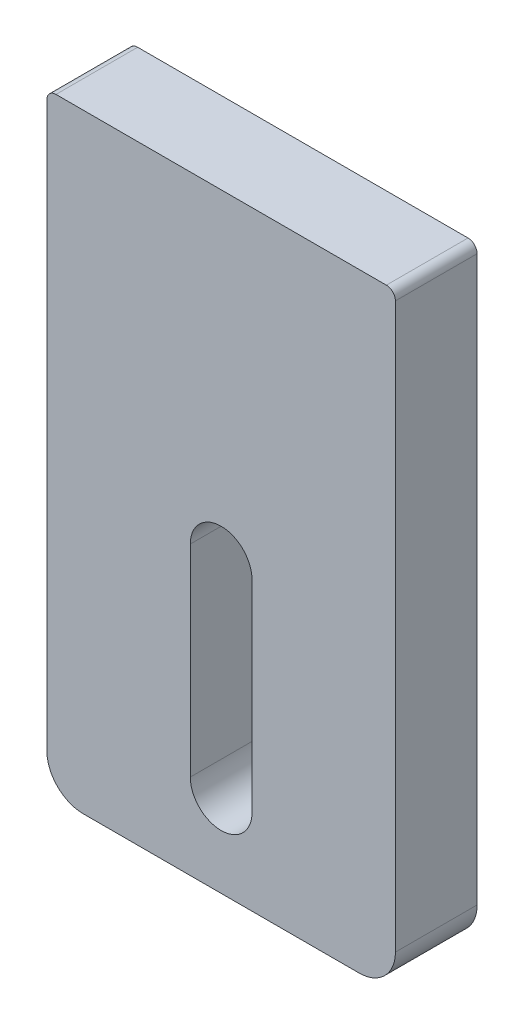
ISO-10303-21;
HEADER;
FILE_DESCRIPTION(('STEP AP214'),'2;1');
FILE_NAME('part.step','',(''),(''),'','','');
FILE_SCHEMA(('AUTOMOTIVE_DESIGN { 1 0 10303 214 1 1 1 1 }'));
ENDSEC;
DATA;
#1=APPLICATION_CONTEXT('core data for automotive mechanical design processes');
#2=APPLICATION_PROTOCOL_DEFINITION('international standard','automotive_design',2000,#1);
#3=PRODUCT_CONTEXT('',#1,'mechanical');
#4=PRODUCT('Part','Part','',(#3));
#5=PRODUCT_RELATED_PRODUCT_CATEGORY('part','',(#4));
#6=PRODUCT_DEFINITION_FORMATION('','',#4);
#7=PRODUCT_DEFINITION_CONTEXT('part definition',#1,'design');
#8=PRODUCT_DEFINITION('design','',#6,#7);
#9=PRODUCT_DEFINITION_SHAPE('','',#8);
#10=(LENGTH_UNIT() NAMED_UNIT(*) SI_UNIT(.MILLI.,.METRE.));
#11=(NAMED_UNIT(*) PLANE_ANGLE_UNIT() SI_UNIT($,.RADIAN.));
#12=(NAMED_UNIT(*) SI_UNIT($,.STERADIAN.) SOLID_ANGLE_UNIT());
#13=UNCERTAINTY_MEASURE_WITH_UNIT(LENGTH_MEASURE(1.E-05),#10,'distance_accuracy_value','');
#14=(GEOMETRIC_REPRESENTATION_CONTEXT(3) GLOBAL_UNCERTAINTY_ASSIGNED_CONTEXT((#13)) GLOBAL_UNIT_ASSIGNED_CONTEXT((#10,
#11,#12)) REPRESENTATION_CONTEXT('',''));
#15=CARTESIAN_POINT('',(0.,0.,0.));
#16=DIRECTION('',(0.,0.,1.));
#17=DIRECTION('',(1.,0.,0.));
#18=AXIS2_PLACEMENT_3D('',#15,#16,#17);
#19=CARTESIAN_POINT('',(0.,0.,0.));
#20=DIRECTION('',(0.,0.,1.));
#21=DIRECTION('',(1.,0.,0.));
#22=AXIS2_PLACEMENT_3D('',#19,#20,#21);
#23=PLANE('',#22);
#24=CARTESIAN_POINT('',(0.,-28.8669759238448,0.));
#25=DIRECTION('',(0.,0.,1.));
#26=DIRECTION('',(1.,0.,0.));
#27=AXIS2_PLACEMENT_3D('',#24,#25,#26);
#28=CIRCLE('',#27,1.69999999999998);
#29=CARTESIAN_POINT('',(-1.69999999999997,-28.8669759238448,0.));
#30=VERTEX_POINT('',#29);
#31=CARTESIAN_POINT('',(1.69999999999999,-28.8669759238448,0.));
#32=VERTEX_POINT('',#31);
#33=EDGE_CURVE('E176',#30,#32,#28,.T.);
#34=ORIENTED_EDGE('',*,*,#33,.T.);
#35=DIRECTION('',(0.,1.,0.));
#36=VECTOR('',#35,1.);
#37=CARTESIAN_POINT('',(1.69999999999999,-17.7508743286044,0.));
#38=LINE('',#37,#36);
#39=CARTESIAN_POINT('',(1.69999999999998,-17.7508743286044,0.));
#40=VERTEX_POINT('',#39);
#41=EDGE_CURVE('E222',#32,#40,#38,.T.);
#42=ORIENTED_EDGE('',*,*,#41,.T.);
#43=CARTESIAN_POINT('',(0.,-17.7508743286044,0.));
#44=DIRECTION('',(0.,0.,1.));
#45=DIRECTION('',(1.,0.,0.));
#46=AXIS2_PLACEMENT_3D('',#43,#44,#45);
#47=CIRCLE('',#46,1.69999999999998);
#48=CARTESIAN_POINT('',(-1.69999999999997,-17.7508743286044,0.));
#49=VERTEX_POINT('',#48);
#50=EDGE_CURVE('E225',#40,#49,#47,.T.);
#51=ORIENTED_EDGE('',*,*,#50,.T.);
#52=DIRECTION('',(0.,-1.,0.));
#53=VECTOR('',#52,1.);
#54=CARTESIAN_POINT('',(-1.69999999999997,-28.8669759238448,0.));
#55=LINE('',#54,#53);
#56=EDGE_CURVE('E212',#49,#30,#55,.T.);
#57=ORIENTED_EDGE('',*,*,#56,.T.);
#58=EDGE_LOOP('',(#34,#42,#51,#57));
#59=FACE_BOUND('',#58,.T.);
#60=CARTESIAN_POINT('',(-7.60000000000002,-31.5669759238448,0.));
#61=DIRECTION('',(0.,0.,1.));
#62=DIRECTION('',(1.,0.,0.));
#63=AXIS2_PLACEMENT_3D('',#60,#61,#62);
#64=CIRCLE('',#63,1.5);
#65=CARTESIAN_POINT('',(-7.60000000000002,-33.0669759238448,0.));
#66=VERTEX_POINT('',#65);
#67=CARTESIAN_POINT('',(-9.10000000000002,-31.5669759238448,0.));
#68=VERTEX_POINT('',#67);
#69=EDGE_CURVE('E184',#66,#68,#64,.F.);
#70=ORIENTED_EDGE('',*,*,#69,.T.);
#71=DIRECTION('',(0.,1.,0.));
#72=VECTOR('',#71,1.);
#73=CARTESIAN_POINT('',(-9.10000000000002,0.,0.));
#74=LINE('',#73,#72);
#75=CARTESIAN_POINT('',(-9.10000000000002,-10.,0.));
#76=VERTEX_POINT('',#75);
#77=EDGE_CURVE('E180',#68,#76,#74,.T.);
#78=ORIENTED_EDGE('',*,*,#77,.T.);
#79=DIRECTION('',(1.,0.,0.));
#80=VECTOR('',#79,1.);
#81=CARTESIAN_POINT('',(-9.60000000000002,-10.,0.));
#82=LINE('',#81,#80);
#83=CARTESIAN_POINT('',(9.10000000000002,-10.,0.));
#84=VERTEX_POINT('',#83);
#85=EDGE_CURVE('E200',#76,#84,#82,.T.);
#86=ORIENTED_EDGE('',*,*,#85,.T.);
#87=DIRECTION('',(0.,-1.,0.));
#88=VECTOR('',#87,1.);
#89=CARTESIAN_POINT('',(9.10000000000002,0.,0.));
#90=LINE('',#89,#88);
#91=CARTESIAN_POINT('',(9.10000000000002,-31.5669759238448,0.));
#92=VERTEX_POINT('',#91);
#93=EDGE_CURVE('E179',#84,#92,#90,.T.);
#94=ORIENTED_EDGE('',*,*,#93,.T.);
#95=CARTESIAN_POINT('',(7.60000000000002,-31.5669759238448,0.));
#96=DIRECTION('',(0.,0.,1.));
#97=DIRECTION('',(1.,0.,0.));
#98=AXIS2_PLACEMENT_3D('',#95,#96,#97);
#99=CIRCLE('',#98,1.49999999999999);
#100=CARTESIAN_POINT('',(7.60000000000002,-33.0669759238448,0.));
#101=VERTEX_POINT('',#100);
#102=EDGE_CURVE('E283',#92,#101,#99,.F.);
#103=ORIENTED_EDGE('',*,*,#102,.T.);
#104=DIRECTION('',(-1.,0.,0.));
#105=VECTOR('',#104,1.);
#106=CARTESIAN_POINT('',(0.,-33.0669759238448,0.));
#107=LINE('',#106,#105);
#108=EDGE_CURVE('E285',#101,#66,#107,.T.);
#109=ORIENTED_EDGE('',*,*,#108,.T.);
#110=EDGE_LOOP('',(#70,#78,#86,#94,#103,#109));
#111=FACE_BOUND('',#110,.T.);
#112=ADVANCED_FACE('F32',(#59,#111),#23,.F.);
#113=CARTESIAN_POINT('',(9.60000000000002,-33.5669759238448,5.));
#114=DIRECTION('',(-1.,0.,0.));
#115=DIRECTION('',(0.,-1.,0.));
#116=AXIS2_PLACEMENT_3D('',#113,#114,#115);
#117=PLANE('',#116);
#118=DIRECTION('',(0.,0.,-1.));
#119=VECTOR('',#118,1.);
#120=CARTESIAN_POINT('',(9.60000000000002,-31.5669759238448,5.));
#121=LINE('',#120,#119);
#122=CARTESIAN_POINT('',(9.60000000000002,-31.5669759238448,5.));
#123=VERTEX_POINT('',#122);
#124=CARTESIAN_POINT('',(9.60000000000002,-31.5669759238448,0.5));
#125=VERTEX_POINT('',#124);
#126=EDGE_CURVE('E153',#123,#125,#121,.T.);
#127=ORIENTED_EDGE('',*,*,#126,.T.);
#128=DIRECTION('',(0.,1.,0.));
#129=VECTOR('',#128,1.);
#130=CARTESIAN_POINT('',(9.60000000000002,-33.5669759238448,0.5));
#131=LINE('',#130,#129);
#132=CARTESIAN_POINT('',(9.60000000000002,-10.,0.5));
#133=VERTEX_POINT('',#132);
#134=EDGE_CURVE('E11',#125,#133,#131,.T.);
#135=ORIENTED_EDGE('',*,*,#134,.T.);
#136=DIRECTION('',(0.,1.,0.));
#137=VECTOR('',#136,1.);
#138=CARTESIAN_POINT('',(9.60000000000002,-10.,0.5));
#139=LINE('',#138,#137);
#140=CARTESIAN_POINT('',(9.60000000000002,-0.500000000000018,0.5));
#141=VERTEX_POINT('',#140);
#142=EDGE_CURVE('E150',#133,#141,#139,.T.);
#143=ORIENTED_EDGE('',*,*,#142,.T.);
#144=DIRECTION('',(0.,0.,-1.));
#145=VECTOR('',#144,1.);
#146=CARTESIAN_POINT('',(9.60000000000002,-0.500000000000014,5.));
#147=LINE('',#146,#145);
#148=CARTESIAN_POINT('',(9.60000000000002,-0.500000000000014,5.));
#149=VERTEX_POINT('',#148);
#150=EDGE_CURVE('E270',#141,#149,#147,.F.);
#151=ORIENTED_EDGE('',*,*,#150,.T.);
#152=DIRECTION('',(0.,1.,0.));
#153=VECTOR('',#152,1.);
#154=CARTESIAN_POINT('',(9.60000000000002,-33.5669759238448,5.));
#155=LINE('',#154,#153);
#156=EDGE_CURVE('E242',#123,#149,#155,.T.);
#157=ORIENTED_EDGE('',*,*,#156,.F.);
#158=EDGE_LOOP('',(#127,#135,#143,#151,#157));
#159=FACE_BOUND('',#158,.T.);
#160=ADVANCED_FACE('F148',(#159),#117,.F.);
#161=CARTESIAN_POINT('',(-9.60000000000002,0.,5.));
#162=DIRECTION('',(1.,0.,0.));
#163=DIRECTION('',(0.,1.,0.));
#164=AXIS2_PLACEMENT_3D('',#161,#162,#163);
#165=PLANE('',#164);
#166=DIRECTION('',(0.,-1.,0.));
#167=VECTOR('',#166,1.);
#168=CARTESIAN_POINT('',(-9.60000000000002,0.,0.5));
#169=LINE('',#168,#167);
#170=CARTESIAN_POINT('',(-9.60000000000002,-0.500000000000014,0.5));
#171=VERTEX_POINT('',#170);
#172=CARTESIAN_POINT('',(-9.60000000000002,-10.,0.5));
#173=VERTEX_POINT('',#172);
#174=EDGE_CURVE('E171',#171,#173,#169,.T.);
#175=ORIENTED_EDGE('',*,*,#174,.T.);
#176=DIRECTION('',(0.,-1.,0.));
#177=VECTOR('',#176,1.);
#178=CARTESIAN_POINT('',(-9.60000000000002,0.,0.5));
#179=LINE('',#178,#177);
#180=CARTESIAN_POINT('',(-9.60000000000002,-31.5669759238448,0.5));
#181=VERTEX_POINT('',#180);
#182=EDGE_CURVE('E279',#173,#181,#179,.T.);
#183=ORIENTED_EDGE('',*,*,#182,.T.);
#184=DIRECTION('',(0.,0.,-1.));
#185=VECTOR('',#184,1.);
#186=CARTESIAN_POINT('',(-9.60000000000002,-31.5669759238448,5.));
#187=LINE('',#186,#185);
#188=CARTESIAN_POINT('',(-9.60000000000002,-31.5669759238448,5.));
#189=VERTEX_POINT('',#188);
#190=EDGE_CURVE('E255',#181,#189,#187,.F.);
#191=ORIENTED_EDGE('',*,*,#190,.T.);
#192=DIRECTION('',(0.,-1.,0.));
#193=VECTOR('',#192,1.);
#194=CARTESIAN_POINT('',(-9.60000000000002,0.,5.));
#195=LINE('',#194,#193);
#196=CARTESIAN_POINT('',(-9.60000000000002,-0.500000000000014,5.));
#197=VERTEX_POINT('',#196);
#198=EDGE_CURVE('E248',#197,#189,#195,.T.);
#199=ORIENTED_EDGE('',*,*,#198,.F.);
#200=DIRECTION('',(0.,0.,-1.));
#201=VECTOR('',#200,1.);
#202=CARTESIAN_POINT('',(-9.60000000000002,-0.500000000000014,5.));
#203=LINE('',#202,#201);
#204=EDGE_CURVE('E276',#197,#171,#203,.T.);
#205=ORIENTED_EDGE('',*,*,#204,.T.);
#206=EDGE_LOOP('',(#175,#183,#191,#199,#205));
#207=FACE_BOUND('',#206,.T.);
#208=ADVANCED_FACE('F299',(#207),#165,.F.);
#209=CARTESIAN_POINT('',(0.,0.,5.));
#210=DIRECTION('',(0.,0.,1.));
#211=DIRECTION('',(1.,0.,0.));
#212=AXIS2_PLACEMENT_3D('',#209,#210,#211);
#213=PLANE('',#212);
#214=ORIENTED_EDGE('',*,*,#156,.T.);
#215=CARTESIAN_POINT('',(9.10000000000002,-0.500000000000014,5.));
#216=DIRECTION('',(0.,0.,1.));
#217=DIRECTION('',(1.,0.,0.));
#218=AXIS2_PLACEMENT_3D('',#215,#216,#217);
#219=CIRCLE('',#218,0.5);
#220=CARTESIAN_POINT('',(9.10000000000002,0.,5.));
#221=VERTEX_POINT('',#220);
#222=EDGE_CURVE('E274',#149,#221,#219,.T.);
#223=ORIENTED_EDGE('',*,*,#222,.T.);
#224=DIRECTION('',(-1.,0.,0.));
#225=VECTOR('',#224,1.);
#226=CARTESIAN_POINT('',(9.60000000000002,0.,5.));
#227=LINE('',#226,#225);
#228=CARTESIAN_POINT('',(-9.10000000000001,0.,5.));
#229=VERTEX_POINT('',#228);
#230=EDGE_CURVE('E245',#221,#229,#227,.T.);
#231=ORIENTED_EDGE('',*,*,#230,.T.);
#232=CARTESIAN_POINT('',(-9.10000000000002,-0.500000000000014,5.));
#233=DIRECTION('',(0.,0.,1.));
#234=DIRECTION('',(1.,0.,0.));
#235=AXIS2_PLACEMENT_3D('',#232,#233,#234);
#236=CIRCLE('',#235,0.5);
#237=EDGE_CURVE('E272',#229,#197,#236,.T.);
#238=ORIENTED_EDGE('',*,*,#237,.T.);
#239=ORIENTED_EDGE('',*,*,#198,.T.);
#240=CARTESIAN_POINT('',(-7.60000000000002,-31.5669759238448,5.));
#241=DIRECTION('',(0.,0.,1.));
#242=DIRECTION('',(1.,0.,0.));
#243=AXIS2_PLACEMENT_3D('',#240,#241,#242);
#244=CIRCLE('',#243,2.);
#245=CARTESIAN_POINT('',(-7.60000000000002,-33.5669759238448,5.));
#246=VERTEX_POINT('',#245);
#247=EDGE_CURVE('E259',#189,#246,#244,.T.);
#248=ORIENTED_EDGE('',*,*,#247,.T.);
#249=DIRECTION('',(1.,0.,0.));
#250=VECTOR('',#249,1.);
#251=CARTESIAN_POINT('',(-9.60000000000002,-33.5669759238448,5.));
#252=LINE('',#251,#250);
#253=CARTESIAN_POINT('',(7.60000000000002,-33.5669759238448,5.));
#254=VERTEX_POINT('',#253);
#255=EDGE_CURVE('E239',#246,#254,#252,.T.);
#256=ORIENTED_EDGE('',*,*,#255,.T.);
#257=CARTESIAN_POINT('',(7.60000000000002,-31.5669759238448,5.));
#258=DIRECTION('',(0.,0.,1.));
#259=DIRECTION('',(1.,0.,0.));
#260=AXIS2_PLACEMENT_3D('',#257,#258,#259);
#261=CIRCLE('',#260,2.);
#262=EDGE_CURVE('E257',#254,#123,#261,.T.);
#263=ORIENTED_EDGE('',*,*,#262,.T.);
#264=EDGE_LOOP('',(#214,#223,#231,#238,#239,#248,#256,#263));
#265=FACE_BOUND('',#264,.T.);
#266=DIRECTION('',(0.,1.,0.));
#267=VECTOR('',#266,1.);
#268=CARTESIAN_POINT('',(1.69999999999999,-17.7508743286044,5.));
#269=LINE('',#268,#267);
#270=CARTESIAN_POINT('',(1.69999999999999,-28.8669759238448,5.));
#271=VERTEX_POINT('',#270);
#272=CARTESIAN_POINT('',(1.69999999999998,-17.7508743286044,5.));
#273=VERTEX_POINT('',#272);
#274=EDGE_CURVE('E211',#271,#273,#269,.T.);
#275=ORIENTED_EDGE('',*,*,#274,.F.);
#276=CARTESIAN_POINT('',(0.,-28.8669759238448,5.));
#277=DIRECTION('',(0.,0.,1.));
#278=DIRECTION('',(1.,0.,0.));
#279=AXIS2_PLACEMENT_3D('',#276,#277,#278);
#280=CIRCLE('',#279,1.69999999999998);
#281=CARTESIAN_POINT('',(-1.69999999999997,-28.8669759238448,5.));
#282=VERTEX_POINT('',#281);
#283=EDGE_CURVE('E209',#282,#271,#280,.T.);
#284=ORIENTED_EDGE('',*,*,#283,.F.);
#285=DIRECTION('',(0.,-1.,0.));
#286=VECTOR('',#285,1.);
#287=CARTESIAN_POINT('',(-1.69999999999997,-28.8669759238448,5.));
#288=LINE('',#287,#286);
#289=CARTESIAN_POINT('',(-1.69999999999997,-17.7508743286044,5.));
#290=VERTEX_POINT('',#289);
#291=EDGE_CURVE('E217',#290,#282,#288,.T.);
#292=ORIENTED_EDGE('',*,*,#291,.F.);
#293=CARTESIAN_POINT('',(0.,-17.7508743286044,5.));
#294=DIRECTION('',(0.,0.,1.));
#295=DIRECTION('',(1.,0.,0.));
#296=AXIS2_PLACEMENT_3D('',#293,#294,#295);
#297=CIRCLE('',#296,1.69999999999998);
#298=EDGE_CURVE('E214',#273,#290,#297,.T.);
#299=ORIENTED_EDGE('',*,*,#298,.F.);
#300=EDGE_LOOP('',(#275,#284,#292,#299));
#301=FACE_BOUND('',#300,.T.);
#302=ADVANCED_FACE('F305',(#265,#301),#213,.T.);
#303=CARTESIAN_POINT('',(-9.60000000000002,-33.5669759238448,5.));
#304=DIRECTION('',(0.,1.,0.));
#305=DIRECTION('',(0.,0.,1.));
#306=AXIS2_PLACEMENT_3D('',#303,#304,#305);
#307=PLANE('',#306);
#308=DIRECTION('',(0.,0.,-1.));
#309=VECTOR('',#308,1.);
#310=CARTESIAN_POINT('',(-7.60000000000002,-33.5669759238448,5.));
#311=LINE('',#310,#309);
#312=CARTESIAN_POINT('',(-7.60000000000002,-33.5669759238448,0.5));
#313=VERTEX_POINT('',#312);
#314=EDGE_CURVE('E253',#246,#313,#311,.T.);
#315=ORIENTED_EDGE('',*,*,#314,.T.);
#316=DIRECTION('',(1.,0.,0.));
#317=VECTOR('',#316,1.);
#318=CARTESIAN_POINT('',(-9.60000000000002,-33.5669759238448,0.5));
#319=LINE('',#318,#317);
#320=CARTESIAN_POINT('',(7.60000000000002,-33.5669759238448,0.5));
#321=VERTEX_POINT('',#320);
#322=EDGE_CURVE('E56',#313,#321,#319,.T.);
#323=ORIENTED_EDGE('',*,*,#322,.T.);
#324=DIRECTION('',(0.,0.,-1.));
#325=VECTOR('',#324,1.);
#326=CARTESIAN_POINT('',(7.60000000000002,-33.5669759238448,5.));
#327=LINE('',#326,#325);
#328=EDGE_CURVE('E251',#321,#254,#327,.F.);
#329=ORIENTED_EDGE('',*,*,#328,.T.);
#330=ORIENTED_EDGE('',*,*,#255,.F.);
#331=EDGE_LOOP('',(#315,#323,#329,#330));
#332=FACE_BOUND('',#331,.T.);
#333=ADVANCED_FACE('F308',(#332),#307,.F.);
#334=CARTESIAN_POINT('',(9.60000000000002,0.,5.));
#335=DIRECTION('',(0.,-1.,0.));
#336=DIRECTION('',(0.,0.,-1.));
#337=AXIS2_PLACEMENT_3D('',#334,#335,#336);
#338=PLANE('',#337);
#339=ORIENTED_EDGE('',*,*,#230,.F.);
#340=DIRECTION('',(0.,0.,-1.));
#341=VECTOR('',#340,1.);
#342=CARTESIAN_POINT('',(9.10000000000002,0.,5.));
#343=LINE('',#342,#341);
#344=CARTESIAN_POINT('',(9.10000000000002,0.,0.5));
#345=VERTEX_POINT('',#344);
#346=EDGE_CURVE('E264',#221,#345,#343,.T.);
#347=ORIENTED_EDGE('',*,*,#346,.T.);
#348=DIRECTION('',(-1.,0.,0.));
#349=VECTOR('',#348,1.);
#350=CARTESIAN_POINT('',(9.60000000000002,0.,0.5));
#351=LINE('',#350,#349);
#352=CARTESIAN_POINT('',(-9.10000000000001,0.,0.5));
#353=VERTEX_POINT('',#352);
#354=EDGE_CURVE('E203',#345,#353,#351,.T.);
#355=ORIENTED_EDGE('',*,*,#354,.T.);
#356=DIRECTION('',(0.,0.,-1.));
#357=VECTOR('',#356,1.);
#358=CARTESIAN_POINT('',(-9.10000000000002,0.,5.));
#359=LINE('',#358,#357);
#360=EDGE_CURVE('E262',#353,#229,#359,.F.);
#361=ORIENTED_EDGE('',*,*,#360,.T.);
#362=EDGE_LOOP('',(#339,#347,#355,#361));
#363=FACE_BOUND('',#362,.T.);
#364=ADVANCED_FACE('F331',(#363),#338,.F.);
#365=CARTESIAN_POINT('',(0.,-28.8669759238448,5.));
#366=DIRECTION('',(0.,0.,-1.));
#367=DIRECTION('',(-1.,0.,0.));
#368=AXIS2_PLACEMENT_3D('',#365,#366,#367);
#369=CYLINDRICAL_SURFACE('',#368,1.69999999999998);
#370=ORIENTED_EDGE('',*,*,#33,.F.);
#371=DIRECTION('',(0.,0.,-1.));
#372=VECTOR('',#371,1.);
#373=CARTESIAN_POINT('',(-1.69999999999997,-28.8669759238448,5.));
#374=LINE('',#373,#372);
#375=EDGE_CURVE('E219',#282,#30,#374,.T.);
#376=ORIENTED_EDGE('',*,*,#375,.F.);
#377=ORIENTED_EDGE('',*,*,#283,.T.);
#378=DIRECTION('',(0.,0.,-1.));
#379=VECTOR('',#378,1.);
#380=CARTESIAN_POINT('',(1.69999999999999,-28.8669759238448,5.));
#381=LINE('',#380,#379);
#382=EDGE_CURVE('E236',#271,#32,#381,.T.);
#383=ORIENTED_EDGE('',*,*,#382,.T.);
#384=EDGE_LOOP('',(#370,#376,#377,#383));
#385=FACE_BOUND('',#384,.T.);
#386=ADVANCED_FACE('F333',(#385),#369,.F.);
#387=CARTESIAN_POINT('',(1.69999999999999,-17.7508743286044,5.));
#388=DIRECTION('',(-1.,0.,0.));
#389=DIRECTION('',(0.,-1.,0.));
#390=AXIS2_PLACEMENT_3D('',#387,#388,#389);
#391=PLANE('',#390);
#392=ORIENTED_EDGE('',*,*,#41,.F.);
#393=ORIENTED_EDGE('',*,*,#382,.F.);
#394=ORIENTED_EDGE('',*,*,#274,.T.);
#395=DIRECTION('',(0.,0.,-1.));
#396=VECTOR('',#395,1.);
#397=CARTESIAN_POINT('',(1.69999999999998,-17.7508743286044,5.));
#398=LINE('',#397,#396);
#399=EDGE_CURVE('E234',#273,#40,#398,.T.);
#400=ORIENTED_EDGE('',*,*,#399,.T.);
#401=EDGE_LOOP('',(#392,#393,#394,#400));
#402=FACE_BOUND('',#401,.T.);
#403=ADVANCED_FACE('F471',(#402),#391,.T.);
#404=CARTESIAN_POINT('',(0.,-17.7508743286044,5.));
#405=DIRECTION('',(0.,0.,-1.));
#406=DIRECTION('',(-1.,0.,0.));
#407=AXIS2_PLACEMENT_3D('',#404,#405,#406);
#408=CYLINDRICAL_SURFACE('',#407,1.69999999999998);
#409=ORIENTED_EDGE('',*,*,#50,.F.);
#410=ORIENTED_EDGE('',*,*,#399,.F.);
#411=ORIENTED_EDGE('',*,*,#298,.T.);
#412=DIRECTION('',(0.,0.,-1.));
#413=VECTOR('',#412,1.);
#414=CARTESIAN_POINT('',(-1.69999999999997,-17.7508743286044,5.));
#415=LINE('',#414,#413);
#416=EDGE_CURVE('E232',#290,#49,#415,.T.);
#417=ORIENTED_EDGE('',*,*,#416,.T.);
#418=EDGE_LOOP('',(#409,#410,#411,#417));
#419=FACE_BOUND('',#418,.T.);
#420=ADVANCED_FACE('F461',(#419),#408,.F.);
#421=CARTESIAN_POINT('',(-1.69999999999997,-28.8669759238448,5.));
#422=DIRECTION('',(1.,0.,0.));
#423=DIRECTION('',(0.,1.,0.));
#424=AXIS2_PLACEMENT_3D('',#421,#422,#423);
#425=PLANE('',#424);
#426=ORIENTED_EDGE('',*,*,#56,.F.);
#427=ORIENTED_EDGE('',*,*,#416,.F.);
#428=ORIENTED_EDGE('',*,*,#291,.T.);
#429=ORIENTED_EDGE('',*,*,#375,.T.);
#430=EDGE_LOOP('',(#426,#427,#428,#429));
#431=FACE_BOUND('',#430,.T.);
#432=ADVANCED_FACE('F340',(#431),#425,.T.);
#433=CARTESIAN_POINT('',(-7.60000000000002,-31.5669759238448,5.));
#434=DIRECTION('',(0.,0.,-1.));
#435=DIRECTION('',(-1.,0.,0.));
#436=AXIS2_PLACEMENT_3D('',#433,#434,#435);
#437=CYLINDRICAL_SURFACE('',#436,2.);
#438=ORIENTED_EDGE('',*,*,#190,.F.);
#439=CARTESIAN_POINT('',(-7.60000000000002,-31.5669759238448,0.5));
#440=DIRECTION('',(0.,0.,1.));
#441=DIRECTION('',(1.,0.,0.));
#442=AXIS2_PLACEMENT_3D('',#439,#440,#441);
#443=CIRCLE('',#442,2.);
#444=EDGE_CURVE('E182',#181,#313,#443,.T.);
#445=ORIENTED_EDGE('',*,*,#444,.T.);
#446=ORIENTED_EDGE('',*,*,#314,.F.);
#447=ORIENTED_EDGE('',*,*,#247,.F.);
#448=EDGE_LOOP('',(#438,#445,#446,#447));
#449=FACE_BOUND('',#448,.T.);
#450=ADVANCED_FACE('F302',(#449),#437,.T.);
#451=CARTESIAN_POINT('',(7.60000000000002,-31.5669759238448,5.));
#452=DIRECTION('',(0.,0.,-1.));
#453=DIRECTION('',(-1.,0.,0.));
#454=AXIS2_PLACEMENT_3D('',#451,#452,#453);
#455=CYLINDRICAL_SURFACE('',#454,2.);
#456=ORIENTED_EDGE('',*,*,#328,.F.);
#457=CARTESIAN_POINT('',(7.60000000000002,-31.5669759238448,0.5));
#458=DIRECTION('',(0.,0.,1.));
#459=DIRECTION('',(1.,0.,0.));
#460=AXIS2_PLACEMENT_3D('',#457,#458,#459);
#461=CIRCLE('',#460,2.);
#462=EDGE_CURVE('E41',#321,#125,#461,.T.);
#463=ORIENTED_EDGE('',*,*,#462,.T.);
#464=ORIENTED_EDGE('',*,*,#126,.F.);
#465=ORIENTED_EDGE('',*,*,#262,.F.);
#466=EDGE_LOOP('',(#456,#463,#464,#465));
#467=FACE_BOUND('',#466,.T.);
#468=ADVANCED_FACE('F309',(#467),#455,.T.);
#469=CARTESIAN_POINT('',(-9.60000000000002,-10.,0.5));
#470=DIRECTION('',(0.,1.,0.));
#471=DIRECTION('',(0.,0.,1.));
#472=AXIS2_PLACEMENT_3D('',#469,#470,#471);
#473=PLANE('',#472);
#474=ORIENTED_EDGE('',*,*,#85,.F.);
#475=DIRECTION('',(0.70710678118655,0.,-0.707106781186545));
#476=VECTOR('',#475,1.);
#477=CARTESIAN_POINT('',(-9.60000000000002,-10.,0.499999999999999));
#478=LINE('',#477,#476);
#479=EDGE_CURVE('E166',#76,#173,#478,.F.);
#480=ORIENTED_EDGE('',*,*,#479,.T.);
#481=DIRECTION('',(1.,0.,0.));
#482=VECTOR('',#481,1.);
#483=CARTESIAN_POINT('',(-9.60000000000002,-10.,0.5));
#484=LINE('',#483,#482);
#485=EDGE_CURVE('E160',#173,#133,#484,.T.);
#486=ORIENTED_EDGE('',*,*,#485,.T.);
#487=DIRECTION('',(0.70710678118655,0.,0.707106781186545));
#488=VECTOR('',#487,1.);
#489=CARTESIAN_POINT('',(0.,-10.,-9.10000000000002));
#490=LINE('',#489,#488);
#491=EDGE_CURVE('E163',#133,#84,#490,.F.);
#492=ORIENTED_EDGE('',*,*,#491,.T.);
#493=EDGE_LOOP('',(#474,#480,#486,#492));
#494=FACE_BOUND('',#493,.T.);
#495=ADVANCED_FACE('F162',(#494),#473,.T.);
#496=CARTESIAN_POINT('',(0.,0.,0.5));
#497=DIRECTION('',(0.,0.,1.));
#498=DIRECTION('',(1.,0.,0.));
#499=AXIS2_PLACEMENT_3D('',#496,#497,#498);
#500=PLANE('',#499);
#501=ORIENTED_EDGE('',*,*,#354,.F.);
#502=CARTESIAN_POINT('',(9.10000000000002,-0.500000000000014,0.5));
#503=DIRECTION('',(0.,0.,1.));
#504=DIRECTION('',(1.,0.,0.));
#505=AXIS2_PLACEMENT_3D('',#502,#503,#504);
#506=CIRCLE('',#505,0.5);
#507=EDGE_CURVE('E175',#345,#141,#506,.F.);
#508=ORIENTED_EDGE('',*,*,#507,.T.);
#509=ORIENTED_EDGE('',*,*,#142,.F.);
#510=ORIENTED_EDGE('',*,*,#485,.F.);
#511=ORIENTED_EDGE('',*,*,#174,.F.);
#512=CARTESIAN_POINT('',(-9.10000000000002,-0.500000000000014,0.5));
#513=DIRECTION('',(0.,0.,1.));
#514=DIRECTION('',(1.,0.,0.));
#515=AXIS2_PLACEMENT_3D('',#512,#513,#514);
#516=CIRCLE('',#515,0.5);
#517=EDGE_CURVE('E267',#171,#353,#516,.F.);
#518=ORIENTED_EDGE('',*,*,#517,.T.);
#519=EDGE_LOOP('',(#501,#508,#509,#510,#511,#518));
#520=FACE_BOUND('',#519,.T.);
#521=ADVANCED_FACE('F174',(#520),#500,.F.);
#522=CARTESIAN_POINT('',(9.10000000000002,-0.500000000000014,5.));
#523=DIRECTION('',(0.,0.,-1.));
#524=DIRECTION('',(-1.,0.,0.));
#525=AXIS2_PLACEMENT_3D('',#522,#523,#524);
#526=CYLINDRICAL_SURFACE('',#525,0.5);
#527=ORIENTED_EDGE('',*,*,#222,.F.);
#528=ORIENTED_EDGE('',*,*,#150,.F.);
#529=ORIENTED_EDGE('',*,*,#507,.F.);
#530=ORIENTED_EDGE('',*,*,#346,.F.);
#531=EDGE_LOOP('',(#527,#528,#529,#530));
#532=FACE_BOUND('',#531,.T.);
#533=ADVANCED_FACE('F343',(#532),#526,.T.);
#534=CARTESIAN_POINT('',(-9.10000000000002,-0.500000000000014,5.));
#535=DIRECTION('',(0.,0.,-1.));
#536=DIRECTION('',(-1.,0.,0.));
#537=AXIS2_PLACEMENT_3D('',#534,#535,#536);
#538=CYLINDRICAL_SURFACE('',#537,0.5);
#539=ORIENTED_EDGE('',*,*,#237,.F.);
#540=ORIENTED_EDGE('',*,*,#360,.F.);
#541=ORIENTED_EDGE('',*,*,#517,.F.);
#542=ORIENTED_EDGE('',*,*,#204,.F.);
#543=EDGE_LOOP('',(#539,#540,#541,#542));
#544=FACE_BOUND('',#543,.T.);
#545=ADVANCED_FACE('F346',(#544),#538,.T.);
#546=CARTESIAN_POINT('',(9.60000000000002,-33.5669759238448,0.5));
#547=DIRECTION('',(-0.707106781186545,0.,0.70710678118655));
#548=DIRECTION('',(0.,1.,0.));
#549=AXIS2_PLACEMENT_3D('',#546,#547,#548);
#550=PLANE('',#549);
#551=ORIENTED_EDGE('',*,*,#491,.F.);
#552=ORIENTED_EDGE('',*,*,#134,.F.);
#553=DIRECTION('',(0.70710678118655,0.,0.707106781186545));
#554=VECTOR('',#553,1.);
#555=CARTESIAN_POINT('',(9.10000000000002,-31.5669759238448,0.));
#556=LINE('',#555,#554);
#557=EDGE_CURVE('E36',#92,#125,#556,.T.);
#558=ORIENTED_EDGE('',*,*,#557,.F.);
#559=ORIENTED_EDGE('',*,*,#93,.F.);
#560=EDGE_LOOP('',(#551,#552,#558,#559));
#561=FACE_BOUND('',#560,.T.);
#562=ADVANCED_FACE('F34',(#561),#550,.F.);
#563=CARTESIAN_POINT('',(7.60000000000002,-31.5669759238448,0.));
#564=DIRECTION('',(0.,0.,1.));
#565=DIRECTION('',(1.,0.,0.));
#566=AXIS2_PLACEMENT_3D('',#563,#564,#565);
#567=CONICAL_SURFACE('',#566,1.49999999999999,0.785398163397454);
#568=ORIENTED_EDGE('',*,*,#557,.T.);
#569=ORIENTED_EDGE('',*,*,#462,.F.);
#570=DIRECTION('',(0.,-0.707106781186553,0.707106781186543));
#571=VECTOR('',#570,1.);
#572=CARTESIAN_POINT('',(7.60000000000002,-33.0669759238448,0.));
#573=LINE('',#572,#571);
#574=EDGE_CURVE('E195',#101,#321,#573,.T.);
#575=ORIENTED_EDGE('',*,*,#574,.F.);
#576=ORIENTED_EDGE('',*,*,#102,.F.);
#577=EDGE_LOOP('',(#568,#569,#575,#576));
#578=FACE_BOUND('',#577,.T.);
#579=ADVANCED_FACE('F310',(#578),#567,.T.);
#580=CARTESIAN_POINT('',(-9.60000000000002,-33.5669759238448,0.5));
#581=DIRECTION('',(0.,0.707106781186542,0.707106781186552));
#582=DIRECTION('',(1.,0.,0.));
#583=AXIS2_PLACEMENT_3D('',#580,#581,#582);
#584=PLANE('',#583);
#585=ORIENTED_EDGE('',*,*,#574,.T.);
#586=ORIENTED_EDGE('',*,*,#322,.F.);
#587=DIRECTION('',(0.,-0.707106781186552,0.707106781186542));
#588=VECTOR('',#587,1.);
#589=CARTESIAN_POINT('',(-7.60000000000002,-33.0669759238448,0.));
#590=LINE('',#589,#588);
#591=EDGE_CURVE('E193',#66,#313,#590,.T.);
#592=ORIENTED_EDGE('',*,*,#591,.F.);
#593=ORIENTED_EDGE('',*,*,#108,.F.);
#594=EDGE_LOOP('',(#585,#586,#592,#593));
#595=FACE_BOUND('',#594,.T.);
#596=ADVANCED_FACE('F311',(#595),#584,.F.);
#597=CARTESIAN_POINT('',(-7.60000000000002,-31.5669759238448,0.));
#598=DIRECTION('',(0.,0.,1.));
#599=DIRECTION('',(1.,0.,0.));
#600=AXIS2_PLACEMENT_3D('',#597,#598,#599);
#601=CONICAL_SURFACE('',#600,1.5,0.785398163397452);
#602=ORIENTED_EDGE('',*,*,#591,.T.);
#603=ORIENTED_EDGE('',*,*,#444,.F.);
#604=DIRECTION('',(-0.70710678118655,0.,0.707106781186545));
#605=VECTOR('',#604,1.);
#606=CARTESIAN_POINT('',(-9.10000000000002,-31.5669759238448,0.));
#607=LINE('',#606,#605);
#608=EDGE_CURVE('E191',#68,#181,#607,.T.);
#609=ORIENTED_EDGE('',*,*,#608,.F.);
#610=ORIENTED_EDGE('',*,*,#69,.F.);
#611=EDGE_LOOP('',(#602,#603,#609,#610));
#612=FACE_BOUND('',#611,.T.);
#613=ADVANCED_FACE('F294',(#612),#601,.T.);
#614=CARTESIAN_POINT('',(-9.60000000000002,0.,0.5));
#615=DIRECTION('',(0.707106781186545,0.,0.70710678118655));
#616=DIRECTION('',(0.,-1.,0.));
#617=AXIS2_PLACEMENT_3D('',#614,#615,#616);
#618=PLANE('',#617);
#619=ORIENTED_EDGE('',*,*,#479,.F.);
#620=ORIENTED_EDGE('',*,*,#77,.F.);
#621=ORIENTED_EDGE('',*,*,#608,.T.);
#622=ORIENTED_EDGE('',*,*,#182,.F.);
#623=EDGE_LOOP('',(#619,#620,#621,#622));
#624=FACE_BOUND('',#623,.T.);
#625=ADVANCED_FACE('F292',(#624),#618,.F.);
#626=CLOSED_SHELL('',(#112,#160,#208,#302,#333,#364,#386,#403,#420,#432,#450,#468,#495,#521,
#533,#545,#562,#579,#596,#613,#625));
#627=MANIFOLD_SOLID_BREP('B2',#626);
#628=ADVANCED_BREP_SHAPE_REPRESENTATION('',(#18,#627),#14);
#629=SHAPE_DEFINITION_REPRESENTATION(#9,#628);
ENDSEC;
END-ISO-10303-21;
